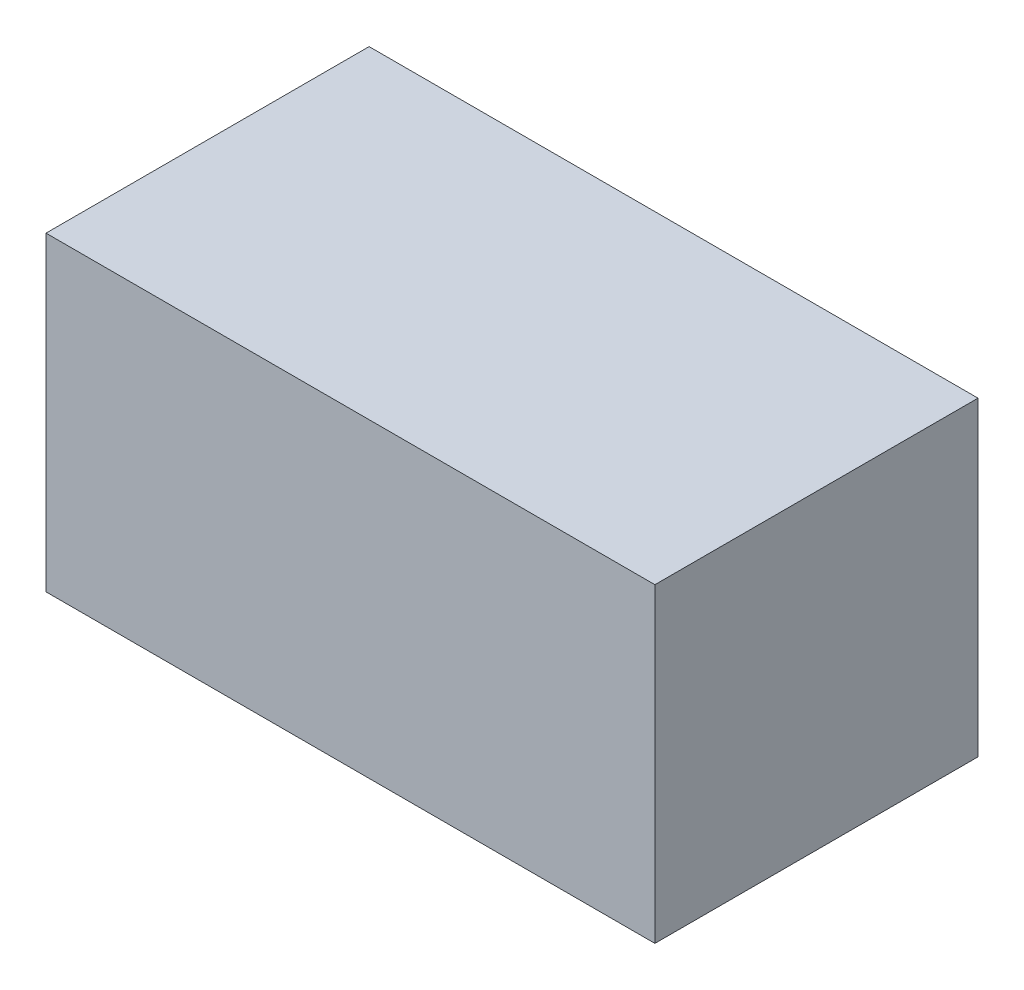
ISO-10303-21;
HEADER;
FILE_DESCRIPTION(('STEP AP214'),'2;1');
FILE_NAME('part.step','',(''),(''),'','','');
FILE_SCHEMA(('AUTOMOTIVE_DESIGN { 1 0 10303 214 1 1 1 1 }'));
ENDSEC;
DATA;
#1=APPLICATION_CONTEXT('core data for automotive mechanical design processes');
#2=APPLICATION_PROTOCOL_DEFINITION('international standard','automotive_design',2000,#1);
#3=PRODUCT_CONTEXT('',#1,'mechanical');
#4=PRODUCT('Part','Part','',(#3));
#5=PRODUCT_RELATED_PRODUCT_CATEGORY('part','',(#4));
#6=PRODUCT_DEFINITION_FORMATION('','',#4);
#7=PRODUCT_DEFINITION_CONTEXT('part definition',#1,'design');
#8=PRODUCT_DEFINITION('design','',#6,#7);
#9=PRODUCT_DEFINITION_SHAPE('','',#8);
#10=(LENGTH_UNIT() NAMED_UNIT(*) SI_UNIT(.MILLI.,.METRE.));
#11=(NAMED_UNIT(*) PLANE_ANGLE_UNIT() SI_UNIT($,.RADIAN.));
#12=(NAMED_UNIT(*) SI_UNIT($,.STERADIAN.) SOLID_ANGLE_UNIT());
#13=UNCERTAINTY_MEASURE_WITH_UNIT(LENGTH_MEASURE(1.E-05),#10,'distance_accuracy_value','');
#14=(GEOMETRIC_REPRESENTATION_CONTEXT(3) GLOBAL_UNCERTAINTY_ASSIGNED_CONTEXT((#13)) GLOBAL_UNIT_ASSIGNED_CONTEXT((#10,
#11,#12)) REPRESENTATION_CONTEXT('',''));
#15=CARTESIAN_POINT('',(0.,0.,0.));
#16=DIRECTION('',(0.,0.,1.));
#17=DIRECTION('',(1.,0.,0.));
#18=AXIS2_PLACEMENT_3D('',#15,#16,#17);
#19=CARTESIAN_POINT('',(-24.5,12.5,26.));
#20=DIRECTION('',(1.,0.,0.));
#21=DIRECTION('',(0.,1.,0.));
#22=AXIS2_PLACEMENT_3D('',#19,#20,#21);
#23=PLANE('',#22);
#24=DIRECTION('',(0.,-1.,0.));
#25=VECTOR('',#24,1.);
#26=CARTESIAN_POINT('',(-24.5,12.5,0.));
#27=LINE('',#26,#25);
#28=CARTESIAN_POINT('',(-24.5,12.5,0.));
#29=VERTEX_POINT('',#28);
#30=CARTESIAN_POINT('',(-24.5,-12.5,0.));
#31=VERTEX_POINT('',#30);
#32=EDGE_CURVE('E96',#29,#31,#27,.T.);
#33=ORIENTED_EDGE('',*,*,#32,.T.);
#34=DIRECTION('',(0.,0.,-1.));
#35=VECTOR('',#34,1.);
#36=CARTESIAN_POINT('',(-24.5,-12.5,26.));
#37=LINE('',#36,#35);
#38=CARTESIAN_POINT('',(-24.5,-12.5,26.));
#39=VERTEX_POINT('',#38);
#40=EDGE_CURVE('E11',#39,#31,#37,.T.);
#41=ORIENTED_EDGE('',*,*,#40,.F.);
#42=DIRECTION('',(0.,-1.,0.));
#43=VECTOR('',#42,1.);
#44=CARTESIAN_POINT('',(-24.5,12.5,26.));
#45=LINE('',#44,#43);
#46=CARTESIAN_POINT('',(-24.5,12.5,26.));
#47=VERTEX_POINT('',#46);
#48=EDGE_CURVE('E84',#47,#39,#45,.T.);
#49=ORIENTED_EDGE('',*,*,#48,.F.);
#50=DIRECTION('',(0.,0.,-1.));
#51=VECTOR('',#50,1.);
#52=CARTESIAN_POINT('',(-24.5,12.5,26.));
#53=LINE('',#52,#51);
#54=EDGE_CURVE('E92',#47,#29,#53,.T.);
#55=ORIENTED_EDGE('',*,*,#54,.T.);
#56=EDGE_LOOP('',(#33,#41,#49,#55));
#57=FACE_BOUND('',#56,.T.);
#58=ADVANCED_FACE('F33',(#57),#23,.F.);
#59=CARTESIAN_POINT('',(24.5,-12.5,26.));
#60=DIRECTION('',(0.,1.,0.));
#61=DIRECTION('',(-1.,0.,0.));
#62=AXIS2_PLACEMENT_3D('',#59,#60,#61);
#63=PLANE('',#62);
#64=DIRECTION('',(1.,0.,0.));
#65=VECTOR('',#64,1.);
#66=CARTESIAN_POINT('',(24.5,-12.5,0.));
#67=LINE('',#66,#65);
#68=CARTESIAN_POINT('',(24.5,-12.5,0.));
#69=VERTEX_POINT('',#68);
#70=EDGE_CURVE('E88',#31,#69,#67,.T.);
#71=ORIENTED_EDGE('',*,*,#70,.T.);
#72=DIRECTION('',(0.,0.,-1.));
#73=VECTOR('',#72,1.);
#74=CARTESIAN_POINT('',(24.5,-12.5,26.));
#75=LINE('',#74,#73);
#76=CARTESIAN_POINT('',(24.5,-12.5,26.));
#77=VERTEX_POINT('',#76);
#78=EDGE_CURVE('E41',#77,#69,#75,.T.);
#79=ORIENTED_EDGE('',*,*,#78,.F.);
#80=DIRECTION('',(1.,0.,0.));
#81=VECTOR('',#80,1.);
#82=CARTESIAN_POINT('',(24.5,-12.5,26.));
#83=LINE('',#82,#81);
#84=EDGE_CURVE('E79',#39,#77,#83,.T.);
#85=ORIENTED_EDGE('',*,*,#84,.F.);
#86=ORIENTED_EDGE('',*,*,#40,.T.);
#87=EDGE_LOOP('',(#71,#79,#85,#86));
#88=FACE_BOUND('',#87,.T.);
#89=ADVANCED_FACE('F87',(#88),#63,.F.);
#90=CARTESIAN_POINT('',(24.5,12.5,26.));
#91=DIRECTION('',(-1.,0.,0.));
#92=DIRECTION('',(0.,-1.,0.));
#93=AXIS2_PLACEMENT_3D('',#90,#91,#92);
#94=PLANE('',#93);
#95=DIRECTION('',(0.,1.,0.));
#96=VECTOR('',#95,1.);
#97=CARTESIAN_POINT('',(24.5,12.5,0.));
#98=LINE('',#97,#96);
#99=CARTESIAN_POINT('',(24.5,12.5,0.));
#100=VERTEX_POINT('',#99);
#101=EDGE_CURVE('E66',#69,#100,#98,.T.);
#102=ORIENTED_EDGE('',*,*,#101,.T.);
#103=DIRECTION('',(0.,0.,-1.));
#104=VECTOR('',#103,1.);
#105=CARTESIAN_POINT('',(24.5,12.5,26.));
#106=LINE('',#105,#104);
#107=CARTESIAN_POINT('',(24.5,12.5,26.));
#108=VERTEX_POINT('',#107);
#109=EDGE_CURVE('E89',#108,#100,#106,.T.);
#110=ORIENTED_EDGE('',*,*,#109,.F.);
#111=DIRECTION('',(0.,1.,0.));
#112=VECTOR('',#111,1.);
#113=CARTESIAN_POINT('',(24.5,12.5,26.));
#114=LINE('',#113,#112);
#115=EDGE_CURVE('E82',#77,#108,#114,.T.);
#116=ORIENTED_EDGE('',*,*,#115,.F.);
#117=ORIENTED_EDGE('',*,*,#78,.T.);
#118=EDGE_LOOP('',(#102,#110,#116,#117));
#119=FACE_BOUND('',#118,.T.);
#120=ADVANCED_FACE('F90',(#119),#94,.F.);
#121=CARTESIAN_POINT('',(24.5,12.5,26.));
#122=DIRECTION('',(0.,-1.,0.));
#123=DIRECTION('',(1.,0.,0.));
#124=AXIS2_PLACEMENT_3D('',#121,#122,#123);
#125=PLANE('',#124);
#126=DIRECTION('',(-1.,0.,0.));
#127=VECTOR('',#126,1.);
#128=CARTESIAN_POINT('',(24.5,12.5,0.));
#129=LINE('',#128,#127);
#130=EDGE_CURVE('E72',#100,#29,#129,.T.);
#131=ORIENTED_EDGE('',*,*,#130,.T.);
#132=ORIENTED_EDGE('',*,*,#54,.F.);
#133=DIRECTION('',(-1.,0.,0.));
#134=VECTOR('',#133,1.);
#135=CARTESIAN_POINT('',(24.5,12.5,26.));
#136=LINE('',#135,#134);
#137=EDGE_CURVE('E49',#108,#47,#136,.T.);
#138=ORIENTED_EDGE('',*,*,#137,.F.);
#139=ORIENTED_EDGE('',*,*,#109,.T.);
#140=EDGE_LOOP('',(#131,#132,#138,#139));
#141=FACE_BOUND('',#140,.T.);
#142=ADVANCED_FACE('F103',(#141),#125,.F.);
#143=CARTESIAN_POINT('',(0.,0.,26.));
#144=DIRECTION('',(0.,0.,-1.));
#145=DIRECTION('',(-1.,0.,0.));
#146=AXIS2_PLACEMENT_3D('',#143,#144,#145);
#147=PLANE('',#146);
#148=ORIENTED_EDGE('',*,*,#48,.T.);
#149=ORIENTED_EDGE('',*,*,#84,.T.);
#150=ORIENTED_EDGE('',*,*,#115,.T.);
#151=ORIENTED_EDGE('',*,*,#137,.T.);
#152=EDGE_LOOP('',(#148,#149,#150,#151));
#153=FACE_BOUND('',#152,.T.);
#154=ADVANCED_FACE('F80',(#153),#147,.F.);
#155=CARTESIAN_POINT('',(0.,0.,0.));
#156=DIRECTION('',(0.,0.,-1.));
#157=DIRECTION('',(-1.,0.,0.));
#158=AXIS2_PLACEMENT_3D('',#155,#156,#157);
#159=PLANE('',#158);
#160=ORIENTED_EDGE('',*,*,#32,.F.);
#161=ORIENTED_EDGE('',*,*,#130,.F.);
#162=ORIENTED_EDGE('',*,*,#101,.F.);
#163=ORIENTED_EDGE('',*,*,#70,.F.);
#164=EDGE_LOOP('',(#160,#161,#162,#163));
#165=FACE_BOUND('',#164,.T.);
#166=ADVANCED_FACE('F106',(#165),#159,.T.);
#167=CLOSED_SHELL('',(#58,#89,#120,#142,#154,#166));
#168=MANIFOLD_SOLID_BREP('B2',#167);
#169=ADVANCED_BREP_SHAPE_REPRESENTATION('',(#18,#168),#14);
#170=SHAPE_DEFINITION_REPRESENTATION(#9,#169);
ENDSEC;
END-ISO-10303-21;
